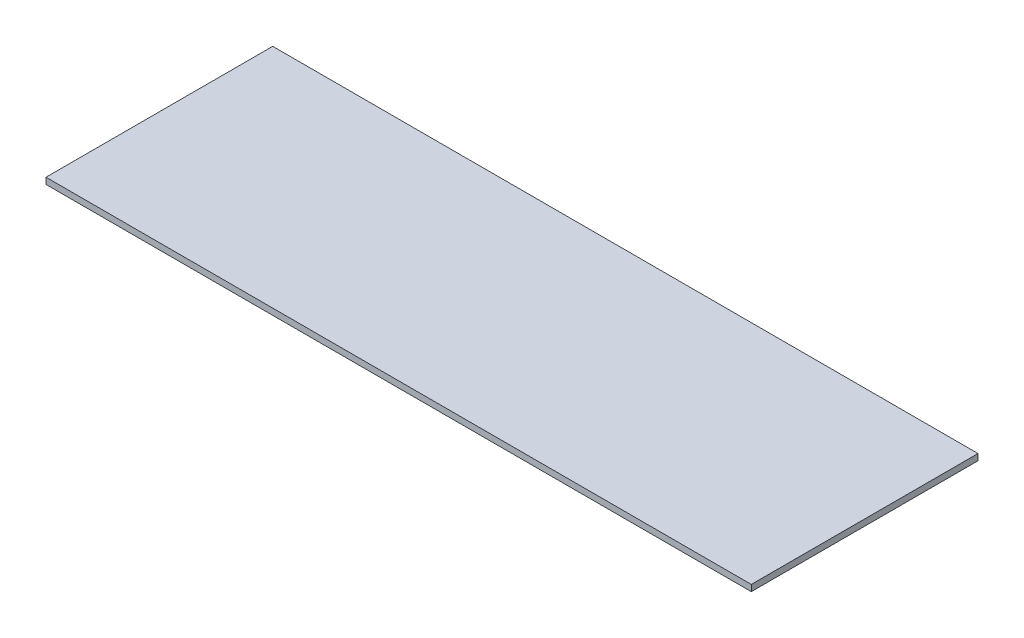
ISO-10303-21;
HEADER;
FILE_DESCRIPTION(('STEP AP214'),'2;1');
FILE_NAME('part.step','',(''),(''),'','','');
FILE_SCHEMA(('AUTOMOTIVE_DESIGN { 1 0 10303 214 1 1 1 1 }'));
ENDSEC;
DATA;
#1=APPLICATION_CONTEXT('core data for automotive mechanical design processes');
#2=APPLICATION_PROTOCOL_DEFINITION('international standard','automotive_design',2000,#1);
#3=PRODUCT_CONTEXT('',#1,'mechanical');
#4=PRODUCT('Part','Part','',(#3));
#5=PRODUCT_RELATED_PRODUCT_CATEGORY('part','',(#4));
#6=PRODUCT_DEFINITION_FORMATION('','',#4);
#7=PRODUCT_DEFINITION_CONTEXT('part definition',#1,'design');
#8=PRODUCT_DEFINITION('design','',#6,#7);
#9=PRODUCT_DEFINITION_SHAPE('','',#8);
#10=(LENGTH_UNIT() NAMED_UNIT(*) SI_UNIT(.MILLI.,.METRE.));
#11=(NAMED_UNIT(*) PLANE_ANGLE_UNIT() SI_UNIT($,.RADIAN.));
#12=(NAMED_UNIT(*) SI_UNIT($,.STERADIAN.) SOLID_ANGLE_UNIT());
#13=UNCERTAINTY_MEASURE_WITH_UNIT(LENGTH_MEASURE(1.E-05),#10,'distance_accuracy_value','');
#14=(GEOMETRIC_REPRESENTATION_CONTEXT(3) GLOBAL_UNCERTAINTY_ASSIGNED_CONTEXT((#13)) GLOBAL_UNIT_ASSIGNED_CONTEXT((#10,
#11,#12)) REPRESENTATION_CONTEXT('',''));
#15=CARTESIAN_POINT('',(0.,0.,0.));
#16=DIRECTION('',(0.,0.,1.));
#17=DIRECTION('',(1.,0.,0.));
#18=AXIS2_PLACEMENT_3D('',#15,#16,#17);
#19=CARTESIAN_POINT('',(355.6,6.35,114.3));
#20=DIRECTION('',(-1.,0.,0.));
#21=DIRECTION('',(0.,0.,1.));
#22=AXIS2_PLACEMENT_3D('',#19,#20,#21);
#23=PLANE('',#22);
#24=DIRECTION('',(0.,0.,-1.));
#25=VECTOR('',#24,1.);
#26=CARTESIAN_POINT('',(355.6,0.,114.3));
#27=LINE('',#26,#25);
#28=CARTESIAN_POINT('',(355.6,0.,114.3));
#29=VERTEX_POINT('',#28);
#30=CARTESIAN_POINT('',(355.6,0.,-114.3));
#31=VERTEX_POINT('',#30);
#32=EDGE_CURVE('E111',#29,#31,#27,.T.);
#33=ORIENTED_EDGE('',*,*,#32,.T.);
#34=DIRECTION('',(0.,-1.,0.));
#35=VECTOR('',#34,1.);
#36=CARTESIAN_POINT('',(355.6,6.35,-114.3));
#37=LINE('',#36,#35);
#38=CARTESIAN_POINT('',(355.6,6.35,-114.3));
#39=VERTEX_POINT('',#38);
#40=EDGE_CURVE('E11',#39,#31,#37,.T.);
#41=ORIENTED_EDGE('',*,*,#40,.F.);
#42=DIRECTION('',(0.,0.,-1.));
#43=VECTOR('',#42,1.);
#44=CARTESIAN_POINT('',(355.6,6.35,114.3));
#45=LINE('',#44,#43);
#46=CARTESIAN_POINT('',(355.6,6.35,114.3));
#47=VERTEX_POINT('',#46);
#48=EDGE_CURVE('E95',#47,#39,#45,.T.);
#49=ORIENTED_EDGE('',*,*,#48,.F.);
#50=DIRECTION('',(0.,-1.,0.));
#51=VECTOR('',#50,1.);
#52=CARTESIAN_POINT('',(355.6,6.35,114.3));
#53=LINE('',#52,#51);
#54=EDGE_CURVE('E107',#47,#29,#53,.T.);
#55=ORIENTED_EDGE('',*,*,#54,.T.);
#56=EDGE_LOOP('',(#33,#41,#49,#55));
#57=FACE_BOUND('',#56,.T.);
#58=ADVANCED_FACE('F43',(#57),#23,.F.);
#59=CARTESIAN_POINT('',(-355.6,6.35,-114.3));
#60=DIRECTION('',(0.,0.,1.));
#61=DIRECTION('',(1.,0.,0.));
#62=AXIS2_PLACEMENT_3D('',#59,#60,#61);
#63=PLANE('',#62);
#64=DIRECTION('',(-1.,0.,0.));
#65=VECTOR('',#64,1.);
#66=CARTESIAN_POINT('',(-355.6,0.,-114.3));
#67=LINE('',#66,#65);
#68=CARTESIAN_POINT('',(-355.6,0.,-114.3));
#69=VERTEX_POINT('',#68);
#70=EDGE_CURVE('E100',#31,#69,#67,.T.);
#71=ORIENTED_EDGE('',*,*,#70,.T.);
#72=DIRECTION('',(0.,-1.,0.));
#73=VECTOR('',#72,1.);
#74=CARTESIAN_POINT('',(-355.6,6.35,-114.3));
#75=LINE('',#74,#73);
#76=CARTESIAN_POINT('',(-355.6,6.35,-114.3));
#77=VERTEX_POINT('',#76);
#78=EDGE_CURVE('E52',#77,#69,#75,.T.);
#79=ORIENTED_EDGE('',*,*,#78,.F.);
#80=DIRECTION('',(-1.,0.,0.));
#81=VECTOR('',#80,1.);
#82=CARTESIAN_POINT('',(-355.6,6.35,-114.3));
#83=LINE('',#82,#81);
#84=EDGE_CURVE('E90',#39,#77,#83,.T.);
#85=ORIENTED_EDGE('',*,*,#84,.F.);
#86=ORIENTED_EDGE('',*,*,#40,.T.);
#87=EDGE_LOOP('',(#71,#79,#85,#86));
#88=FACE_BOUND('',#87,.T.);
#89=ADVANCED_FACE('F99',(#88),#63,.F.);
#90=CARTESIAN_POINT('',(-355.6,6.35,114.3));
#91=DIRECTION('',(1.,0.,0.));
#92=DIRECTION('',(0.,0.,-1.));
#93=AXIS2_PLACEMENT_3D('',#90,#91,#92);
#94=PLANE('',#93);
#95=DIRECTION('',(0.,0.,1.));
#96=VECTOR('',#95,1.);
#97=CARTESIAN_POINT('',(-355.6,0.,114.3));
#98=LINE('',#97,#96);
#99=CARTESIAN_POINT('',(-355.6,0.,114.3));
#100=VERTEX_POINT('',#99);
#101=EDGE_CURVE('E77',#69,#100,#98,.T.);
#102=ORIENTED_EDGE('',*,*,#101,.T.);
#103=DIRECTION('',(0.,-1.,0.));
#104=VECTOR('',#103,1.);
#105=CARTESIAN_POINT('',(-355.6,6.35,114.3));
#106=LINE('',#105,#104);
#107=CARTESIAN_POINT('',(-355.6,6.35,114.3));
#108=VERTEX_POINT('',#107);
#109=EDGE_CURVE('E102',#108,#100,#106,.T.);
#110=ORIENTED_EDGE('',*,*,#109,.F.);
#111=DIRECTION('',(0.,0.,1.));
#112=VECTOR('',#111,1.);
#113=CARTESIAN_POINT('',(-355.6,6.35,114.3));
#114=LINE('',#113,#112);
#115=EDGE_CURVE('E93',#77,#108,#114,.T.);
#116=ORIENTED_EDGE('',*,*,#115,.F.);
#117=ORIENTED_EDGE('',*,*,#78,.T.);
#118=EDGE_LOOP('',(#102,#110,#116,#117));
#119=FACE_BOUND('',#118,.T.);
#120=ADVANCED_FACE('F103',(#119),#94,.F.);
#121=CARTESIAN_POINT('',(-355.6,6.35,114.3));
#122=DIRECTION('',(0.,0.,-1.));
#123=DIRECTION('',(-1.,0.,0.));
#124=AXIS2_PLACEMENT_3D('',#121,#122,#123);
#125=PLANE('',#124);
#126=DIRECTION('',(1.,0.,0.));
#127=VECTOR('',#126,1.);
#128=CARTESIAN_POINT('',(-355.6,0.,114.3));
#129=LINE('',#128,#127);
#130=EDGE_CURVE('E83',#100,#29,#129,.T.);
#131=ORIENTED_EDGE('',*,*,#130,.T.);
#132=ORIENTED_EDGE('',*,*,#54,.F.);
#133=DIRECTION('',(1.,0.,0.));
#134=VECTOR('',#133,1.);
#135=CARTESIAN_POINT('',(-355.6,6.35,114.3));
#136=LINE('',#135,#134);
#137=EDGE_CURVE('E60',#108,#47,#136,.T.);
#138=ORIENTED_EDGE('',*,*,#137,.F.);
#139=ORIENTED_EDGE('',*,*,#109,.T.);
#140=EDGE_LOOP('',(#131,#132,#138,#139));
#141=FACE_BOUND('',#140,.T.);
#142=ADVANCED_FACE('F124',(#141),#125,.F.);
#143=CARTESIAN_POINT('',(0.,6.35,0.));
#144=DIRECTION('',(0.,-1.,0.));
#145=DIRECTION('',(0.,0.,-1.));
#146=AXIS2_PLACEMENT_3D('',#143,#144,#145);
#147=PLANE('',#146);
#148=ORIENTED_EDGE('',*,*,#48,.T.);
#149=ORIENTED_EDGE('',*,*,#84,.T.);
#150=ORIENTED_EDGE('',*,*,#115,.T.);
#151=ORIENTED_EDGE('',*,*,#137,.T.);
#152=EDGE_LOOP('',(#148,#149,#150,#151));
#153=FACE_BOUND('',#152,.T.);
#154=ADVANCED_FACE('F91',(#153),#147,.F.);
#155=CARTESIAN_POINT('',(0.,0.,0.));
#156=DIRECTION('',(0.,-1.,0.));
#157=DIRECTION('',(0.,0.,-1.));
#158=AXIS2_PLACEMENT_3D('',#155,#156,#157);
#159=PLANE('',#158);
#160=ORIENTED_EDGE('',*,*,#32,.F.);
#161=ORIENTED_EDGE('',*,*,#130,.F.);
#162=ORIENTED_EDGE('',*,*,#101,.F.);
#163=ORIENTED_EDGE('',*,*,#70,.F.);
#164=EDGE_LOOP('',(#160,#161,#162,#163));
#165=FACE_BOUND('',#164,.T.);
#166=ADVANCED_FACE('F127',(#165),#159,.T.);
#167=CLOSED_SHELL('',(#58,#89,#120,#142,#154,#166));
#168=MANIFOLD_SOLID_BREP('B2',#167);
#169=ADVANCED_BREP_SHAPE_REPRESENTATION('',(#18,#168),#14);
#170=SHAPE_DEFINITION_REPRESENTATION(#9,#169);
ENDSEC;
END-ISO-10303-21;
